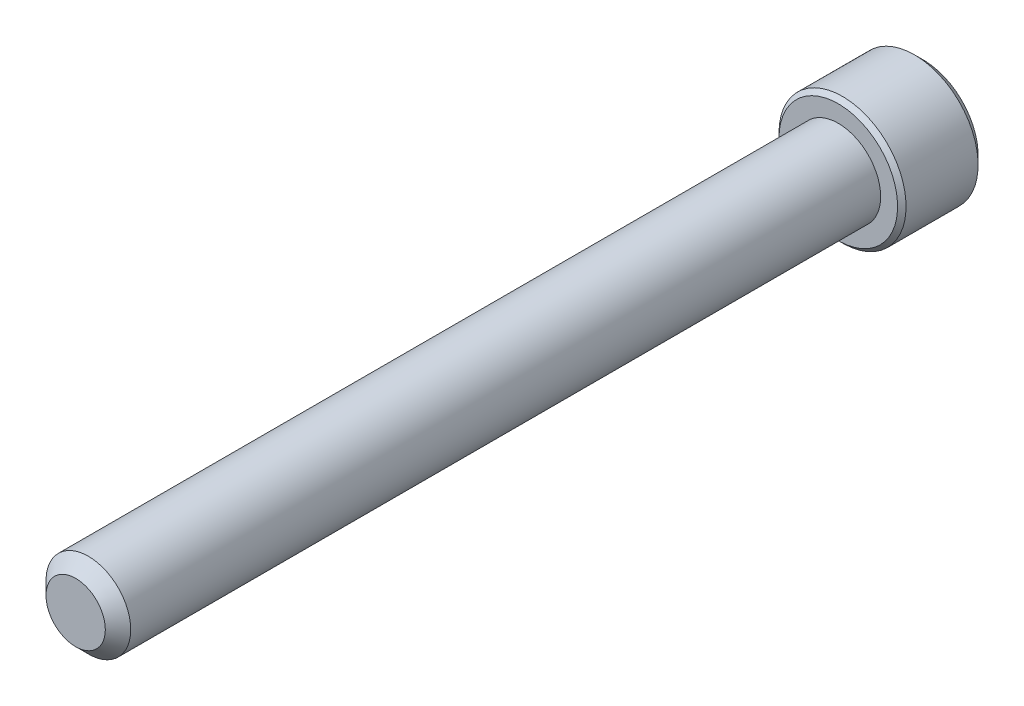
ISO-10303-21;
HEADER;
FILE_DESCRIPTION(('STEP AP214'),'2;1');
FILE_NAME('part.step','',(''),(''),'','','');
FILE_SCHEMA(('AUTOMOTIVE_DESIGN { 1 0 10303 214 1 1 1 1 }'));
ENDSEC;
DATA;
#1=APPLICATION_CONTEXT('core data for automotive mechanical design processes');
#2=APPLICATION_PROTOCOL_DEFINITION('international standard','automotive_design',2000,#1);
#3=PRODUCT_CONTEXT('',#1,'mechanical');
#4=PRODUCT('Part','Part','',(#3));
#5=PRODUCT_RELATED_PRODUCT_CATEGORY('part','',(#4));
#6=PRODUCT_DEFINITION_FORMATION('','',#4);
#7=PRODUCT_DEFINITION_CONTEXT('part definition',#1,'design');
#8=PRODUCT_DEFINITION('design','',#6,#7);
#9=PRODUCT_DEFINITION_SHAPE('','',#8);
#10=(LENGTH_UNIT() NAMED_UNIT(*) SI_UNIT(.MILLI.,.METRE.));
#11=(NAMED_UNIT(*) PLANE_ANGLE_UNIT() SI_UNIT($,.RADIAN.));
#12=(NAMED_UNIT(*) SI_UNIT($,.STERADIAN.) SOLID_ANGLE_UNIT());
#13=UNCERTAINTY_MEASURE_WITH_UNIT(LENGTH_MEASURE(1.E-05),#10,'distance_accuracy_value','');
#14=(GEOMETRIC_REPRESENTATION_CONTEXT(3) GLOBAL_UNCERTAINTY_ASSIGNED_CONTEXT((#13)) GLOBAL_UNIT_ASSIGNED_CONTEXT((#10,
#11,#12)) REPRESENTATION_CONTEXT('',''));
#15=CARTESIAN_POINT('',(0.,0.,0.));
#16=DIRECTION('',(0.,0.,1.));
#17=DIRECTION('',(1.,0.,0.));
#18=AXIS2_PLACEMENT_3D('',#15,#16,#17);
#19=CARTESIAN_POINT('',(0.,0.,-57.15));
#20=DIRECTION('',(0.,0.,1.));
#21=DIRECTION('',(1.,0.,0.));
#22=AXIS2_PLACEMENT_3D('',#19,#20,#21);
#23=CYLINDRICAL_SURFACE('',#22,3.175);
#24=CARTESIAN_POINT('',(0.,0.,-57.15));
#25=DIRECTION('',(0.,0.,-1.));
#26=DIRECTION('',(-1.,0.,0.));
#27=AXIS2_PLACEMENT_3D('',#24,#25,#26);
#28=CIRCLE('',#27,3.175);
#29=CARTESIAN_POINT('',(-3.175,0.,-57.15));
#30=VERTEX_POINT('',#29);
#31=EDGE_CURVE('E211',#30,#30,#28,.F.);
#32=ORIENTED_EDGE('',*,*,#31,.T.);
#33=EDGE_LOOP('',(#32));
#34=FACE_BOUND('',#33,.T.);
#35=CARTESIAN_POINT('',(0.,0.,-0.952500000000009));
#36=DIRECTION('',(0.,0.,1.));
#37=DIRECTION('',(1.,0.,0.));
#38=AXIS2_PLACEMENT_3D('',#35,#36,#37);
#39=CIRCLE('',#38,3.175);
#40=CARTESIAN_POINT('',(3.175,0.,-0.952500000000009));
#41=VERTEX_POINT('',#40);
#42=EDGE_CURVE('E107',#41,#41,#39,.F.);
#43=ORIENTED_EDGE('',*,*,#42,.T.);
#44=EDGE_LOOP('',(#43));
#45=FACE_BOUND('',#44,.T.);
#46=ADVANCED_FACE('F33',(#34,#45),#23,.T.);
#47=CARTESIAN_POINT('',(0.,0.,0.));
#48=DIRECTION('',(0.,0.,1.));
#49=DIRECTION('',(1.,0.,0.));
#50=AXIS2_PLACEMENT_3D('',#47,#48,#49);
#51=PLANE('',#50);
#52=CARTESIAN_POINT('',(0.,0.,0.));
#53=DIRECTION('',(0.,0.,1.));
#54=DIRECTION('',(1.,0.,0.));
#55=AXIS2_PLACEMENT_3D('',#52,#53,#54);
#56=CIRCLE('',#55,2.2225);
#57=CARTESIAN_POINT('',(2.2225,0.,0.));
#58=VERTEX_POINT('',#57);
#59=EDGE_CURVE('E210',#58,#58,#56,.T.);
#60=ORIENTED_EDGE('',*,*,#59,.T.);
#61=EDGE_LOOP('',(#60));
#62=FACE_BOUND('',#61,.T.);
#63=ADVANCED_FACE('F187',(#62),#51,.T.);
#64=CARTESIAN_POINT('',(0.,0.,0.));
#65=DIRECTION('',(0.,0.,-1.));
#66=DIRECTION('',(-1.,0.,0.));
#67=AXIS2_PLACEMENT_3D('',#64,#65,#66);
#68=CONICAL_SURFACE('',#67,2.2225,0.785398163397446);
#69=ORIENTED_EDGE('',*,*,#42,.F.);
#70=EDGE_LOOP('',(#69));
#71=FACE_BOUND('',#70,.T.);
#72=ORIENTED_EDGE('',*,*,#59,.F.);
#73=EDGE_LOOP('',(#72));
#74=FACE_BOUND('',#73,.T.);
#75=ADVANCED_FACE('F193',(#71,#74),#68,.T.);
#76=CARTESIAN_POINT('',(0.,0.,-63.5));
#77=DIRECTION('',(0.,0.,1.));
#78=DIRECTION('',(1.,0.,0.));
#79=AXIS2_PLACEMENT_3D('',#76,#77,#78);
#80=CYLINDRICAL_SURFACE('',#79,4.7625);
#81=CARTESIAN_POINT('',(0.,0.,-57.4675));
#82=DIRECTION('',(0.,0.,-1.));
#83=DIRECTION('',(-1.,0.,0.));
#84=AXIS2_PLACEMENT_3D('',#81,#82,#83);
#85=CIRCLE('',#84,4.7625);
#86=CARTESIAN_POINT('',(-4.7625,0.,-57.4675));
#87=VERTEX_POINT('',#86);
#88=EDGE_CURVE('E41',#87,#87,#85,.T.);
#89=ORIENTED_EDGE('',*,*,#88,.T.);
#90=EDGE_LOOP('',(#89));
#91=FACE_BOUND('',#90,.T.);
#92=CARTESIAN_POINT('',(0.,0.,-62.865));
#93=DIRECTION('',(0.,0.,-1.));
#94=DIRECTION('',(-1.,0.,0.));
#95=AXIS2_PLACEMENT_3D('',#92,#93,#94);
#96=CIRCLE('',#95,4.7625);
#97=CARTESIAN_POINT('',(-4.7625,0.,-62.865));
#98=VERTEX_POINT('',#97);
#99=EDGE_CURVE('E170',#98,#98,#96,.F.);
#100=ORIENTED_EDGE('',*,*,#99,.T.);
#101=EDGE_LOOP('',(#100));
#102=FACE_BOUND('',#101,.T.);
#103=ADVANCED_FACE('F175',(#91,#102),#80,.T.);
#104=CARTESIAN_POINT('',(0.,0.,-63.5));
#105=DIRECTION('',(0.,0.,-1.));
#106=DIRECTION('',(-1.,0.,0.));
#107=AXIS2_PLACEMENT_3D('',#104,#105,#106);
#108=PLANE('',#107);
#109=CARTESIAN_POINT('',(0.,0.,-63.5));
#110=DIRECTION('',(0.,0.,-1.));
#111=DIRECTION('',(-1.,0.,0.));
#112=AXIS2_PLACEMENT_3D('',#109,#110,#111);
#113=CIRCLE('',#112,4.12749999999999);
#114=CARTESIAN_POINT('',(-4.12749999999999,0.,-63.5));
#115=VERTEX_POINT('',#114);
#116=EDGE_CURVE('E106',#115,#115,#113,.T.);
#117=ORIENTED_EDGE('',*,*,#116,.T.);
#118=EDGE_LOOP('',(#117));
#119=FACE_BOUND('',#118,.T.);
#120=CARTESIAN_POINT('',(0.,0.,-63.5));
#121=DIRECTION('',(0.,0.,-1.));
#122=DIRECTION('',(-1.,0.,0.));
#123=AXIS2_PLACEMENT_3D('',#120,#121,#122);
#124=CIRCLE('',#123,2.74963065701559);
#125=CARTESIAN_POINT('',(-2.38125,1.3748153285078,-63.5));
#126=VERTEX_POINT('',#125);
#127=CARTESIAN_POINT('',(0.,2.74963065701559,-63.5));
#128=VERTEX_POINT('',#127);
#129=EDGE_CURVE('E87',#126,#128,#124,.T.);
#130=ORIENTED_EDGE('',*,*,#129,.F.);
#131=CARTESIAN_POINT('',(-2.38125,-1.3748153285078,-63.5));
#132=VERTEX_POINT('',#131);
#133=EDGE_CURVE('E47',#132,#126,#124,.T.);
#134=ORIENTED_EDGE('',*,*,#133,.F.);
#135=CARTESIAN_POINT('',(0.,-2.74963065701559,-63.5));
#136=VERTEX_POINT('',#135);
#137=EDGE_CURVE('E269',#136,#132,#124,.T.);
#138=ORIENTED_EDGE('',*,*,#137,.F.);
#139=CARTESIAN_POINT('',(2.38125,-1.3748153285078,-63.5));
#140=VERTEX_POINT('',#139);
#141=EDGE_CURVE('E54',#140,#136,#124,.T.);
#142=ORIENTED_EDGE('',*,*,#141,.F.);
#143=CARTESIAN_POINT('',(2.38125,1.3748153285078,-63.5));
#144=VERTEX_POINT('',#143);
#145=EDGE_CURVE('E128',#144,#140,#124,.T.);
#146=ORIENTED_EDGE('',*,*,#145,.F.);
#147=EDGE_CURVE('E96',#128,#144,#124,.T.);
#148=ORIENTED_EDGE('',*,*,#147,.F.);
#149=EDGE_LOOP('',(#130,#134,#138,#142,#146,#148));
#150=FACE_BOUND('',#149,.T.);
#151=ADVANCED_FACE('F127',(#119,#150),#108,.T.);
#152=CARTESIAN_POINT('',(0.,0.,-57.15));
#153=DIRECTION('',(0.,0.,-1.));
#154=DIRECTION('',(-1.,0.,0.));
#155=AXIS2_PLACEMENT_3D('',#152,#153,#154);
#156=PLANE('',#155);
#157=CARTESIAN_POINT('',(0.,0.,-57.15));
#158=DIRECTION('',(0.,0.,-1.));
#159=DIRECTION('',(-1.,0.,0.));
#160=AXIS2_PLACEMENT_3D('',#157,#158,#159);
#161=CIRCLE('',#160,4.445);
#162=CARTESIAN_POINT('',(-4.445,0.,-57.15));
#163=VERTEX_POINT('',#162);
#164=EDGE_CURVE('E11',#163,#163,#161,.F.);
#165=ORIENTED_EDGE('',*,*,#164,.T.);
#166=EDGE_LOOP('',(#165));
#167=FACE_BOUND('',#166,.T.);
#168=ORIENTED_EDGE('',*,*,#31,.F.);
#169=EDGE_LOOP('',(#168));
#170=FACE_BOUND('',#169,.T.);
#171=ADVANCED_FACE('F281',(#167,#170),#156,.F.);
#172=CARTESIAN_POINT('',(0.,0.,-63.5));
#173=DIRECTION('',(0.,0.,-1.));
#174=DIRECTION('',(-1.,0.,0.));
#175=AXIS2_PLACEMENT_3D('',#172,#173,#174);
#176=CONICAL_SURFACE('',#175,2.74963065701559,0.78539816339745);
#177=ORIENTED_EDGE('',*,*,#147,.T.);
#178=CARTESIAN_POINT('',(-0.000200000000002186,2.74974612706943,-63.5001154773272));
#179=CARTESIAN_POINT('',(0.0816567823790472,2.70248609172789,-63.4528948967096));
#180=CARTESIAN_POINT('',(0.164882333771756,2.65443579722786,-63.4084475752929));
#181=CARTESIAN_POINT('',(0.334588480838034,2.55645590753601,-63.3270654569856));
#182=CARTESIAN_POINT('',(0.421085217353096,2.50651699342501,-63.2901759430951));
#183=CARTESIAN_POINT('',(0.595501774009036,2.40581754748858,-63.2269834131659));
#184=CARTESIAN_POINT('',(0.683377171180668,2.35508266327639,-63.2005215587295));
#185=CARTESIAN_POINT('',(0.861062594070867,2.25249593653966,-63.1597515156161));
#186=CARTESIAN_POINT('',(0.950867191185862,2.20064722822085,-63.1454128915305));
#187=CARTESIAN_POINT('',(1.10563960313033,2.11128933452159,-63.1324757847701));
#188=CARTESIAN_POINT('',(1.17040744896961,2.07389560129145,-63.1305606046532));
#189=CARTESIAN_POINT('',(1.29983727933556,1.99916925388849,-63.1337866227677));
#190=CARTESIAN_POINT('',(1.36449921879335,1.96183666573622,-63.1389302948571));
#191=CARTESIAN_POINT('',(1.49321254857739,1.88752399013711,-63.1559813108716));
#192=CARTESIAN_POINT('',(1.55726317423485,1.85054434417201,-63.1678962213493));
#193=CARTESIAN_POINT('',(1.68425683890527,1.77722451768917,-63.197835672352));
#194=CARTESIAN_POINT('',(1.74719996243581,1.74088428837517,-63.2158597445184));
#195=CARTESIAN_POINT('',(1.90842615073218,1.64780030516185,-63.2693688075524));
#196=CARTESIAN_POINT('',(2.00570949128784,1.59163374230437,-63.3088874208722));
#197=CARTESIAN_POINT('',(2.14875606262557,1.50904576583588,-63.3756003435508));
#198=CARTESIAN_POINT('',(2.19589628894397,1.48182934348129,-63.3990402091113));
#199=CARTESIAN_POINT('',(2.28930352636665,1.42790064981105,-63.4480566766595));
#200=CARTESIAN_POINT('',(2.33557105249683,1.40118808114505,-63.4736319667669));
#201=CARTESIAN_POINT('',(2.38145000000001,1.37469985845396,-63.5001154773272));
#202=B_SPLINE_CURVE_WITH_KNOTS('',3,(#178,#179,#180,#181,#182,#183,#184,#185,#186,#187,#188,
#189,#190,#191,#192,#193,#194,#195,#196,#197,#198,#199,#200,#201),.UNSPECIFIED.,.F.,.F.,(4,2,2,
2,2,2,2,2,2,2,2,4),(0.,0.317196610611945,0.636241461041216,0.950218950629218,1.26340583824125,
1.48752413747843,1.71172100167746,1.93616888974081,2.16059957440836,2.51709639744763,
2.69486147369101,2.87251813383155),.UNSPECIFIED.);
#203=EDGE_CURVE('E101',#128,#144,#202,.T.);
#204=ORIENTED_EDGE('',*,*,#203,.F.);
#205=EDGE_LOOP('',(#177,#204));
#206=FACE_BOUND('',#205,.T.);
#207=ADVANCED_FACE('F102',(#206),#176,.F.);
#208=ORIENTED_EDGE('',*,*,#145,.T.);
#209=CARTESIAN_POINT('',(2.38125,-2.76261914440419,-64.3976170860817));
#210=CARTESIAN_POINT('',(2.38125,-2.69544479536901,-64.3467472146641));
#211=CARTESIAN_POINT('',(2.38125,-2.62789666157823,-64.2963629455589));
#212=CARTESIAN_POINT('',(2.38125,-2.49190448977621,-64.1967837708364));
#213=CARTESIAN_POINT('',(2.38125,-2.42346023321904,-64.1475891640069));
#214=CARTESIAN_POINT('',(2.38125,-2.28502676073674,-64.0502575507657));
#215=CARTESIAN_POINT('',(2.38125,-2.21502968492296,-64.0021316856912));
#216=CARTESIAN_POINT('',(2.38125,-2.07385103549331,-63.9076556101338));
#217=CARTESIAN_POINT('',(2.38125,-2.00266954568686,-63.8613052747739));
#218=CARTESIAN_POINT('',(2.38125,-1.85474026844007,-63.7681368561695));
#219=CARTESIAN_POINT('',(2.38125,-1.77790995637351,-63.7214491376499));
#220=CARTESIAN_POINT('',(2.38125,-1.62247617017447,-63.631129605859));
#221=CARTESIAN_POINT('',(2.38125,-1.5438729312885,-63.5874973902755));
#222=CARTESIAN_POINT('',(2.38125,-1.38486272137714,-63.5042071100282));
#223=CARTESIAN_POINT('',(2.38125,-1.30446163393307,-63.4645379009361));
#224=CARTESIAN_POINT('',(2.38125,-1.14145314547589,-63.3900690459263));
#225=CARTESIAN_POINT('',(2.38125,-1.05884677109142,-63.3552671796136));
#226=CARTESIAN_POINT('',(2.38125,-0.898296083334557,-63.294429813229));
#227=CARTESIAN_POINT('',(2.38125,-0.820539229733754,-63.2679047139327));
#228=CARTESIAN_POINT('',(2.38125,-0.663135380856752,-63.2210898392085));
#229=CARTESIAN_POINT('',(2.38125,-0.583488257498861,-63.2008004876119));
#230=CARTESIAN_POINT('',(2.38125,-0.424114177096839,-63.1678604073913));
#231=CARTESIAN_POINT('',(2.38125,-0.344414987504256,-63.1550775337025));
#232=CARTESIAN_POINT('',(2.38125,-0.184141832361606,-63.1374018129255));
#233=CARTESIAN_POINT('',(2.38125,-0.103568024531878,-63.1325075663141));
#234=CARTESIAN_POINT('',(2.38125,0.0546452704451571,-63.1309814589762));
#235=CARTESIAN_POINT('',(2.38125,0.132281935816149,-63.1340477837949));
#236=CARTESIAN_POINT('',(2.38125,0.286899761817848,-63.1476029014608));
#237=CARTESIAN_POINT('',(2.38125,0.363880858672091,-63.1580924083037));
#238=CARTESIAN_POINT('',(2.38125,0.517934845552131,-63.1860957916784));
#239=CARTESIAN_POINT('',(2.38125,0.594985552514197,-63.2037299282363));
#240=CARTESIAN_POINT('',(2.38125,0.747397784971263,-63.2450790150024));
#241=CARTESIAN_POINT('',(2.38125,0.822759444078564,-63.2687934823661));
#242=CARTESIAN_POINT('',(2.38125,1.05910849740066,-63.3521079749025));
#243=CARTESIAN_POINT('',(2.38125,1.21677702097593,-63.4211581302676));
#244=CARTESIAN_POINT('',(2.38125,1.44750538913539,-63.5362600462423));
#245=CARTESIAN_POINT('',(2.38125,1.52359597394722,-63.5766390556527));
#246=CARTESIAN_POINT('',(2.38125,1.67404919579933,-63.6605045047098));
#247=CARTESIAN_POINT('',(2.38125,1.74841213968921,-63.7039903868604));
#248=CARTESIAN_POINT('',(2.38125,1.89195740305346,-63.791219749271));
#249=CARTESIAN_POINT('',(2.38125,1.96121355997409,-63.8348431031729));
#250=CARTESIAN_POINT('',(2.38125,2.0985382616552,-63.9239297072439));
#251=CARTESIAN_POINT('',(2.38125,2.16660671605604,-63.9693930965357));
#252=CARTESIAN_POINT('',(2.38125,2.30115854912696,-64.0614552844234));
#253=CARTESIAN_POINT('',(2.38125,2.36765030390081,-64.1080418918462));
#254=CARTESIAN_POINT('',(2.38125,2.49972444191925,-64.2024503249111));
#255=CARTESIAN_POINT('',(2.38125,2.56530707034482,-64.2502718071541));
#256=CARTESIAN_POINT('',(2.38125,2.63050906958838,-64.2985984122085));
#257=B_SPLINE_CURVE_WITH_KNOTS('',3,(#209,#210,#211,#212,#213,#214,#215,#216,#217,#218,#219,
#220,#221,#222,#223,#224,#225,#226,#227,#228,#229,#230,#231,#232,#233,#234,#235,#236,#237,#238,
#239,#240,#241,#242,#243,#244,#245,#246,#247,#248,#249,#250,#251,#252,#253,#254,#255,#256),
.UNSPECIFIED.,.F.,.F.,(4,2,2,2,2,2,2,2,2,2,2,2,2,2,2,2,2,2,2,2,2,2,2,4),(0.,0.252791871598824,
0.505646586889959,0.760459562213687,1.01525458294591,1.28490904202319,1.55452792920362,
1.82336591151044,2.09208085189144,2.33833488227845,2.58460564635828,2.82639989379205,
3.06815123972669,3.30087188936525,3.53361492618305,3.77045005614643,4.00726638464205,
4.52203846871503,4.78044014408766,5.038795567844,5.28431582225893,5.5298546749629,
5.77340315409169,6.01688462048991),.UNSPECIFIED.);
#258=EDGE_CURVE('E95',#144,#140,#257,.F.);
#259=ORIENTED_EDGE('',*,*,#258,.F.);
#260=EDGE_LOOP('',(#208,#259));
#261=FACE_BOUND('',#260,.T.);
#262=ADVANCED_FACE('F275',(#261),#176,.F.);
#263=ORIENTED_EDGE('',*,*,#141,.T.);
#264=CARTESIAN_POINT('',(2.38145,-1.37469985845396,-63.5001154773272));
#265=CARTESIAN_POINT('',(2.29959321762095,-1.4219598937955,-63.4528948967096));
#266=CARTESIAN_POINT('',(2.21636766622824,-1.47001018829554,-63.4084475752929));
#267=CARTESIAN_POINT('',(2.04666151916196,-1.56799007798739,-63.3270654569856));
#268=CARTESIAN_POINT('',(1.9601647826469,-1.61792899209838,-63.2901759430951));
#269=CARTESIAN_POINT('',(1.78574822599096,-1.71862843803482,-63.2269834131659));
#270=CARTESIAN_POINT('',(1.69787282881932,-1.76936332224701,-63.2005215587295));
#271=CARTESIAN_POINT('',(1.52018740592912,-1.87195004898374,-63.1597515156161));
#272=CARTESIAN_POINT('',(1.43038280881412,-1.92379875730255,-63.1454128915305));
#273=CARTESIAN_POINT('',(1.27561039686965,-2.01315665100182,-63.1324757847701));
#274=CARTESIAN_POINT('',(1.21084255103037,-2.05055038423195,-63.1305606046532));
#275=CARTESIAN_POINT('',(1.08141272066442,-2.12527673163491,-63.1337866227677));
#276=CARTESIAN_POINT('',(1.01675078120664,-2.16260931978718,-63.1389302948571));
#277=CARTESIAN_POINT('',(0.888037451422593,-2.23692199538629,-63.1559813108716));
#278=CARTESIAN_POINT('',(0.823986825765135,-2.27390164135139,-63.1678962213493));
#279=CARTESIAN_POINT('',(0.696993161094715,-2.34722146783423,-63.197835672352));
#280=CARTESIAN_POINT('',(0.634050037564164,-2.38356169714823,-63.2158597445184));
#281=CARTESIAN_POINT('',(0.472823849267811,-2.47664568036155,-63.2693688075524));
#282=CARTESIAN_POINT('',(0.375540508712157,-2.53281224321902,-63.3088874208722));
#283=CARTESIAN_POINT('',(0.23249393737443,-2.61540021968751,-63.3756003435508));
#284=CARTESIAN_POINT('',(0.185353711056033,-2.6426166420421,-63.3990402091113));
#285=CARTESIAN_POINT('',(0.0919464736333571,-2.69654533571234,-63.4480566766595));
#286=CARTESIAN_POINT('',(0.0456789475031738,-2.72325790437834,-63.4736319667669));
#287=CARTESIAN_POINT('',(-0.000200000000005868,-2.74974612706943,-63.5001154773272));
#288=B_SPLINE_CURVE_WITH_KNOTS('',3,(#264,#265,#266,#267,#268,#269,#270,#271,#272,#273,#274,
#275,#276,#277,#278,#279,#280,#281,#282,#283,#284,#285,#286,#287),.UNSPECIFIED.,.F.,.F.,(4,2,2,
2,2,2,2,2,2,2,2,4),(0.,0.317196610611948,0.636241461041223,0.950218950629232,1.26340583824128,
1.48752413747846,1.71172100167748,1.93616888974084,2.16059957440838,2.51709639744763,
2.694861473691,2.87251813383155),.UNSPECIFIED.);
#289=EDGE_CURVE('E138',#140,#136,#288,.T.);
#290=ORIENTED_EDGE('',*,*,#289,.F.);
#291=EDGE_LOOP('',(#263,#290));
#292=FACE_BOUND('',#291,.T.);
#293=ADVANCED_FACE('F272',(#292),#176,.F.);
#294=ORIENTED_EDGE('',*,*,#137,.T.);
#295=CARTESIAN_POINT('',(0.000200000000002537,-2.74974612706943,-63.5001154773272));
#296=CARTESIAN_POINT('',(-0.0816567823790469,-2.70248609172789,-63.4528948967096));
#297=CARTESIAN_POINT('',(-0.164882333771756,-2.65443579722786,-63.4084475752929));
#298=CARTESIAN_POINT('',(-0.334588480838034,-2.55645590753601,-63.3270654569856));
#299=CARTESIAN_POINT('',(-0.421085217353096,-2.50651699342501,-63.2901759430951));
#300=CARTESIAN_POINT('',(-0.595501774009036,-2.40581754748858,-63.2269834131659));
#301=CARTESIAN_POINT('',(-0.683377171180668,-2.35508266327639,-63.2005215587295));
#302=CARTESIAN_POINT('',(-0.861062594070868,-2.25249593653966,-63.1597515156161));
#303=CARTESIAN_POINT('',(-0.950867191185862,-2.20064722822085,-63.1454128915305));
#304=CARTESIAN_POINT('',(-1.10563960313033,-2.11128933452159,-63.1324757847701));
#305=CARTESIAN_POINT('',(-1.17040744896961,-2.07389560129145,-63.1305606046532));
#306=CARTESIAN_POINT('',(-1.29983727933557,-1.99916925388849,-63.1337866227677));
#307=CARTESIAN_POINT('',(-1.36449921879335,-1.96183666573622,-63.1389302948571));
#308=CARTESIAN_POINT('',(-1.49321254857739,-1.88752399013711,-63.1559813108716));
#309=CARTESIAN_POINT('',(-1.55726317423485,-1.85054434417201,-63.1678962213493));
#310=CARTESIAN_POINT('',(-1.68425683890526,-1.77722451768917,-63.197835672352));
#311=CARTESIAN_POINT('',(-1.74719996243582,-1.74088428837517,-63.2158597445184));
#312=CARTESIAN_POINT('',(-1.90842615073218,-1.64780030516185,-63.2693688075524));
#313=CARTESIAN_POINT('',(-2.00570949128784,-1.59163374230437,-63.3088874208722));
#314=CARTESIAN_POINT('',(-2.14875606262557,-1.50904576583588,-63.3756003435508));
#315=CARTESIAN_POINT('',(-2.19589628894397,-1.48182934348129,-63.3990402091113));
#316=CARTESIAN_POINT('',(-2.28930352636665,-1.42790064981105,-63.4480566766595));
#317=CARTESIAN_POINT('',(-2.33557105249683,-1.40118808114505,-63.4736319667669));
#318=CARTESIAN_POINT('',(-2.38145000000001,-1.37469985845396,-63.5001154773272));
#319=B_SPLINE_CURVE_WITH_KNOTS('',3,(#295,#296,#297,#298,#299,#300,#301,#302,#303,#304,#305,
#306,#307,#308,#309,#310,#311,#312,#313,#314,#315,#316,#317,#318),.UNSPECIFIED.,.F.,.F.,(4,2,2,
2,2,2,2,2,2,2,2,4),(0.,0.317196610611945,0.636241461041216,0.950218950629219,1.26340583824125,
1.48752413747844,1.71172100167747,1.93616888974081,2.16059957440836,2.51709639744763,
2.69486147369101,2.87251813383155),.UNSPECIFIED.);
#320=EDGE_CURVE('E246',#136,#132,#319,.T.);
#321=ORIENTED_EDGE('',*,*,#320,.F.);
#322=EDGE_LOOP('',(#294,#321));
#323=FACE_BOUND('',#322,.T.);
#324=ADVANCED_FACE('F271',(#323),#176,.F.);
#325=ORIENTED_EDGE('',*,*,#133,.T.);
#326=CARTESIAN_POINT('',(-2.38125,-2.76261914440418,-64.3976170860817));
#327=CARTESIAN_POINT('',(-2.38125,-2.695444795369,-64.346747214664));
#328=CARTESIAN_POINT('',(-2.38125,-2.62789666157821,-64.2963629455589));
#329=CARTESIAN_POINT('',(-2.38125,-2.49190448977619,-64.1967837708364));
#330=CARTESIAN_POINT('',(-2.38125,-2.42346023321902,-64.1475891640069));
#331=CARTESIAN_POINT('',(-2.38125,-2.28502676073671,-64.0502575507657));
#332=CARTESIAN_POINT('',(-2.38125,-2.21502968492293,-64.0021316856912));
#333=CARTESIAN_POINT('',(-2.38125,-2.07385103549328,-63.9076556101338));
#334=CARTESIAN_POINT('',(-2.38125,-2.00266954568683,-63.8613052747739));
#335=CARTESIAN_POINT('',(-2.38125,-1.85474026844004,-63.7681368561695));
#336=CARTESIAN_POINT('',(-2.38125,-1.77790995637348,-63.7214491376499));
#337=CARTESIAN_POINT('',(-2.38125,-1.62247617017445,-63.631129605859));
#338=CARTESIAN_POINT('',(-2.38125,-1.54387293128848,-63.5874973902755));
#339=CARTESIAN_POINT('',(-2.38125,-1.38486272137712,-63.5042071100282));
#340=CARTESIAN_POINT('',(-2.38125,-1.30446163393305,-63.4645379009361));
#341=CARTESIAN_POINT('',(-2.38125,-1.14145314547588,-63.3900690459263));
#342=CARTESIAN_POINT('',(-2.38125,-1.05884677109141,-63.3552671796135));
#343=CARTESIAN_POINT('',(-2.38125,-0.898296083334547,-63.294429813229));
#344=CARTESIAN_POINT('',(-2.38125,-0.820539229733744,-63.2679047139327));
#345=CARTESIAN_POINT('',(-2.38125,-0.663135380856743,-63.2210898392085));
#346=CARTESIAN_POINT('',(-2.38125,-0.583488257498854,-63.2008004876119));
#347=CARTESIAN_POINT('',(-2.38125,-0.424114177096836,-63.1678604073913));
#348=CARTESIAN_POINT('',(-2.38125,-0.344414987504255,-63.1550775337025));
#349=CARTESIAN_POINT('',(-2.38125,-0.18414183236161,-63.1374018129255));
#350=CARTESIAN_POINT('',(-2.38125,-0.103568024531885,-63.1325075663141));
#351=CARTESIAN_POINT('',(-2.38125,0.0546452704451489,-63.1309814589762));
#352=CARTESIAN_POINT('',(-2.38125,0.132281935816142,-63.1340477837949));
#353=CARTESIAN_POINT('',(-2.38125,0.286899761817842,-63.1476029014608));
#354=CARTESIAN_POINT('',(-2.38125,0.363880858672086,-63.1580924083037));
#355=CARTESIAN_POINT('',(-2.38125,0.517934845552128,-63.1860957916784));
#356=CARTESIAN_POINT('',(-2.38125,0.594985552514195,-63.2037299282363));
#357=CARTESIAN_POINT('',(-2.38125,0.747397784971263,-63.2450790150024));
#358=CARTESIAN_POINT('',(-2.38125,0.822759444078565,-63.2687934823661));
#359=CARTESIAN_POINT('',(-2.38125,1.05910849740066,-63.3521079749025));
#360=CARTESIAN_POINT('',(-2.38125,1.21677702097593,-63.4211581302676));
#361=CARTESIAN_POINT('',(-2.38125,1.44750538913539,-63.5362600462423));
#362=CARTESIAN_POINT('',(-2.38125,1.52359597394723,-63.5766390556527));
#363=CARTESIAN_POINT('',(-2.38125,1.67404919579934,-63.6605045047098));
#364=CARTESIAN_POINT('',(-2.38125,1.74841213968921,-63.7039903868604));
#365=CARTESIAN_POINT('',(-2.38125,1.89195740305346,-63.791219749271));
#366=CARTESIAN_POINT('',(-2.38125,1.96121355997409,-63.8348431031729));
#367=CARTESIAN_POINT('',(-2.38125,2.0985382616552,-63.9239297072439));
#368=CARTESIAN_POINT('',(-2.38125,2.16660671605604,-63.9693930965357));
#369=CARTESIAN_POINT('',(-2.38125,2.30115854912696,-64.0614552844234));
#370=CARTESIAN_POINT('',(-2.38125,2.3676503039008,-64.1080418918462));
#371=CARTESIAN_POINT('',(-2.38125,2.49972444191925,-64.2024503249111));
#372=CARTESIAN_POINT('',(-2.38125,2.56530707034481,-64.2502718071541));
#373=CARTESIAN_POINT('',(-2.38125,2.63050906958838,-64.2985984122085));
#374=B_SPLINE_CURVE_WITH_KNOTS('',3,(#326,#327,#328,#329,#330,#331,#332,#333,#334,#335,#336,
#337,#338,#339,#340,#341,#342,#343,#344,#345,#346,#347,#348,#349,#350,#351,#352,#353,#354,#355,
#356,#357,#358,#359,#360,#361,#362,#363,#364,#365,#366,#367,#368,#369,#370,#371,#372,#373),
.UNSPECIFIED.,.F.,.F.,(4,2,2,2,2,2,2,2,2,2,2,2,2,2,2,2,2,2,2,2,2,2,2,4),(0.,0.252791871598828,
0.505646586889973,0.760459562213706,1.01525458294593,1.2849090420232,1.55452792920363,
1.82336591151043,2.09208085189144,2.33833488227844,2.58460564635827,2.82639989379203,
3.06815123972666,3.30087188936522,3.53361492618303,3.77045005614641,4.00726638464204,
4.52203846871501,4.78044014408765,5.03879556784398,5.28431582225892,5.52985467496288,
5.77340315409167,6.01688462048989),.UNSPECIFIED.);
#375=EDGE_CURVE('E117',#132,#126,#374,.T.);
#376=ORIENTED_EDGE('',*,*,#375,.F.);
#377=EDGE_LOOP('',(#325,#376));
#378=FACE_BOUND('',#377,.T.);
#379=ADVANCED_FACE('F288',(#378),#176,.F.);
#380=ORIENTED_EDGE('',*,*,#129,.T.);
#381=CARTESIAN_POINT('',(-2.38145,1.37469985845396,-63.5001154773272));
#382=CARTESIAN_POINT('',(-2.29959321762095,1.4219598937955,-63.4528948967096));
#383=CARTESIAN_POINT('',(-2.21636766622824,1.47001018829554,-63.4084475752929));
#384=CARTESIAN_POINT('',(-2.04666151916196,1.56799007798739,-63.3270654569856));
#385=CARTESIAN_POINT('',(-1.9601647826469,1.61792899209838,-63.2901759430951));
#386=CARTESIAN_POINT('',(-1.78574822599096,1.71862843803482,-63.2269834131659));
#387=CARTESIAN_POINT('',(-1.69787282881932,1.76936332224701,-63.2005215587295));
#388=CARTESIAN_POINT('',(-1.52018740592912,1.87195004898374,-63.1597515156161));
#389=CARTESIAN_POINT('',(-1.43038280881412,1.92379875730255,-63.1454128915305));
#390=CARTESIAN_POINT('',(-1.27561039686965,2.01315665100182,-63.1324757847701));
#391=CARTESIAN_POINT('',(-1.21084255103037,2.05055038423195,-63.1305606046532));
#392=CARTESIAN_POINT('',(-1.08141272066442,2.12527673163491,-63.1337866227677));
#393=CARTESIAN_POINT('',(-1.01675078120664,2.16260931978718,-63.1389302948571));
#394=CARTESIAN_POINT('',(-0.888037451422595,2.23692199538629,-63.1559813108716));
#395=CARTESIAN_POINT('',(-0.823986825765137,2.27390164135139,-63.1678962213493));
#396=CARTESIAN_POINT('',(-0.696993161094717,2.34722146783423,-63.197835672352));
#397=CARTESIAN_POINT('',(-0.634050037564165,2.38356169714823,-63.2158597445184));
#398=CARTESIAN_POINT('',(-0.472823849267809,2.47664568036155,-63.2693688075524));
#399=CARTESIAN_POINT('',(-0.375540508712152,2.53281224321902,-63.3088874208722));
#400=CARTESIAN_POINT('',(-0.232493937374423,2.61540021968751,-63.3756003435508));
#401=CARTESIAN_POINT('',(-0.185353711056028,2.6426166420421,-63.3990402091113));
#402=CARTESIAN_POINT('',(-0.0919464736333545,2.69654533571234,-63.4480566766595));
#403=CARTESIAN_POINT('',(-0.0456789475031725,2.72325790437834,-63.4736319667669));
#404=CARTESIAN_POINT('',(0.000200000000006204,2.74974612706943,-63.5001154773272));
#405=B_SPLINE_CURVE_WITH_KNOTS('',3,(#381,#382,#383,#384,#385,#386,#387,#388,#389,#390,#391,
#392,#393,#394,#395,#396,#397,#398,#399,#400,#401,#402,#403,#404),.UNSPECIFIED.,.F.,.F.,(4,2,2,
2,2,2,2,2,2,2,2,4),(0.,0.317196610611949,0.636241461041224,0.950218950629233,1.26340583824127,
1.48752413747846,1.71172100167748,1.93616888974083,2.16059957440838,2.51709639744764,
2.69486147369101,2.87251813383155),.UNSPECIFIED.);
#406=EDGE_CURVE('E91',#126,#128,#405,.T.);
#407=ORIENTED_EDGE('',*,*,#406,.F.);
#408=EDGE_LOOP('',(#380,#407));
#409=FACE_BOUND('',#408,.T.);
#410=ADVANCED_FACE('F89',(#409),#176,.F.);
#411=CARTESIAN_POINT('',(2.38125,4.12444598552339,-59.928125));
#412=DIRECTION('',(0.,0.,-1.));
#413=DIRECTION('',(-1.,0.,0.));
#414=AXIS2_PLACEMENT_3D('',#411,#412,#413);
#415=PLANE('',#414);
#416=DIRECTION('',(0.866025403784439,0.5,0.));
#417=VECTOR('',#416,1.);
#418=CARTESIAN_POINT('',(-2.38125,1.3748153285078,-59.928125));
#419=LINE('',#418,#417);
#420=CARTESIAN_POINT('',(-2.38125,1.3748153285078,-59.928125));
#421=VERTEX_POINT('',#420);
#422=CARTESIAN_POINT('',(0.,2.74963065701559,-59.928125));
#423=VERTEX_POINT('',#422);
#424=EDGE_CURVE('E116',#421,#423,#419,.T.);
#425=ORIENTED_EDGE('',*,*,#424,.T.);
#426=DIRECTION('',(0.866025403784439,-0.5,0.));
#427=VECTOR('',#426,1.);
#428=CARTESIAN_POINT('',(0.,2.74963065701559,-59.928125));
#429=LINE('',#428,#427);
#430=CARTESIAN_POINT('',(2.38125,1.3748153285078,-59.928125));
#431=VERTEX_POINT('',#430);
#432=EDGE_CURVE('E121',#423,#431,#429,.T.);
#433=ORIENTED_EDGE('',*,*,#432,.T.);
#434=DIRECTION('',(0.,-1.,0.));
#435=VECTOR('',#434,1.);
#436=CARTESIAN_POINT('',(2.38125,1.3748153285078,-59.928125));
#437=LINE('',#436,#435);
#438=CARTESIAN_POINT('',(2.38125,-1.3748153285078,-59.928125));
#439=VERTEX_POINT('',#438);
#440=EDGE_CURVE('E232',#431,#439,#437,.T.);
#441=ORIENTED_EDGE('',*,*,#440,.T.);
#442=DIRECTION('',(-0.866025403784439,-0.5,0.));
#443=VECTOR('',#442,1.);
#444=CARTESIAN_POINT('',(2.38125,-1.3748153285078,-59.928125));
#445=LINE('',#444,#443);
#446=CARTESIAN_POINT('',(0.,-2.74963065701559,-59.928125));
#447=VERTEX_POINT('',#446);
#448=EDGE_CURVE('E229',#439,#447,#445,.T.);
#449=ORIENTED_EDGE('',*,*,#448,.T.);
#450=DIRECTION('',(-0.866025403784439,0.5,0.));
#451=VECTOR('',#450,1.);
#452=CARTESIAN_POINT('',(0.,-2.74963065701559,-59.928125));
#453=LINE('',#452,#451);
#454=CARTESIAN_POINT('',(-2.38125,-1.3748153285078,-59.928125));
#455=VERTEX_POINT('',#454);
#456=EDGE_CURVE('E226',#447,#455,#453,.T.);
#457=ORIENTED_EDGE('',*,*,#456,.T.);
#458=DIRECTION('',(0.,1.,0.));
#459=VECTOR('',#458,1.);
#460=CARTESIAN_POINT('',(-2.38125,-1.3748153285078,-59.928125));
#461=LINE('',#460,#459);
#462=EDGE_CURVE('E124',#455,#421,#461,.T.);
#463=ORIENTED_EDGE('',*,*,#462,.T.);
#464=EDGE_LOOP('',(#425,#433,#441,#449,#457,#463));
#465=FACE_BOUND('',#464,.T.);
#466=ADVANCED_FACE('F158',(#465),#415,.T.);
#467=CARTESIAN_POINT('',(0.,2.74963065701559,-59.928125));
#468=DIRECTION('',(0.5,0.866025403784439,0.));
#469=DIRECTION('',(-0.866025403784439,0.5,0.));
#470=AXIS2_PLACEMENT_3D('',#467,#468,#469);
#471=PLANE('',#470);
#472=DIRECTION('',(0.,0.,-1.));
#473=VECTOR('',#472,1.);
#474=CARTESIAN_POINT('',(0.,2.74963065701559,-59.928125));
#475=LINE('',#474,#473);
#476=EDGE_CURVE('E113',#423,#128,#475,.T.);
#477=ORIENTED_EDGE('',*,*,#476,.T.);
#478=ORIENTED_EDGE('',*,*,#203,.T.);
#479=DIRECTION('',(0.,0.,-1.));
#480=VECTOR('',#479,1.);
#481=CARTESIAN_POINT('',(2.38125,1.3748153285078,-59.928125));
#482=LINE('',#481,#480);
#483=EDGE_CURVE('E123',#431,#144,#482,.T.);
#484=ORIENTED_EDGE('',*,*,#483,.F.);
#485=ORIENTED_EDGE('',*,*,#432,.F.);
#486=EDGE_LOOP('',(#477,#478,#484,#485));
#487=FACE_BOUND('',#486,.T.);
#488=ADVANCED_FACE('F119',(#487),#471,.F.);
#489=CARTESIAN_POINT('',(2.38125,1.3748153285078,-59.928125));
#490=DIRECTION('',(1.,0.,0.));
#491=DIRECTION('',(0.,1.,0.));
#492=AXIS2_PLACEMENT_3D('',#489,#490,#491);
#493=PLANE('',#492);
#494=ORIENTED_EDGE('',*,*,#483,.T.);
#495=ORIENTED_EDGE('',*,*,#258,.T.);
#496=DIRECTION('',(0.,0.,-1.));
#497=VECTOR('',#496,1.);
#498=CARTESIAN_POINT('',(2.38125,-1.3748153285078,-59.928125));
#499=LINE('',#498,#497);
#500=EDGE_CURVE('E215',#439,#140,#499,.T.);
#501=ORIENTED_EDGE('',*,*,#500,.F.);
#502=ORIENTED_EDGE('',*,*,#440,.F.);
#503=EDGE_LOOP('',(#494,#495,#501,#502));
#504=FACE_BOUND('',#503,.T.);
#505=ADVANCED_FACE('F147',(#504),#493,.F.);
#506=CARTESIAN_POINT('',(2.38125,-1.3748153285078,-59.928125));
#507=DIRECTION('',(0.5,-0.866025403784439,0.));
#508=DIRECTION('',(0.866025403784439,0.5,0.));
#509=AXIS2_PLACEMENT_3D('',#506,#507,#508);
#510=PLANE('',#509);
#511=ORIENTED_EDGE('',*,*,#500,.T.);
#512=ORIENTED_EDGE('',*,*,#289,.T.);
#513=DIRECTION('',(0.,0.,-1.));
#514=VECTOR('',#513,1.);
#515=CARTESIAN_POINT('',(0.,-2.74963065701559,-59.928125));
#516=LINE('',#515,#514);
#517=EDGE_CURVE('E218',#447,#136,#516,.T.);
#518=ORIENTED_EDGE('',*,*,#517,.F.);
#519=ORIENTED_EDGE('',*,*,#448,.F.);
#520=EDGE_LOOP('',(#511,#512,#518,#519));
#521=FACE_BOUND('',#520,.T.);
#522=ADVANCED_FACE('F151',(#521),#510,.F.);
#523=CARTESIAN_POINT('',(0.,-2.74963065701559,-59.928125));
#524=DIRECTION('',(-0.5,-0.866025403784439,0.));
#525=DIRECTION('',(0.866025403784439,-0.5,0.));
#526=AXIS2_PLACEMENT_3D('',#523,#524,#525);
#527=PLANE('',#526);
#528=ORIENTED_EDGE('',*,*,#517,.T.);
#529=ORIENTED_EDGE('',*,*,#320,.T.);
#530=DIRECTION('',(0.,0.,-1.));
#531=VECTOR('',#530,1.);
#532=CARTESIAN_POINT('',(-2.38125,-1.3748153285078,-59.928125));
#533=LINE('',#532,#531);
#534=EDGE_CURVE('E221',#455,#132,#533,.T.);
#535=ORIENTED_EDGE('',*,*,#534,.F.);
#536=ORIENTED_EDGE('',*,*,#456,.F.);
#537=EDGE_LOOP('',(#528,#529,#535,#536));
#538=FACE_BOUND('',#537,.T.);
#539=ADVANCED_FACE('F254',(#538),#527,.F.);
#540=CARTESIAN_POINT('',(-2.38125,-1.3748153285078,-59.928125));
#541=DIRECTION('',(-1.,0.,0.));
#542=DIRECTION('',(0.,-1.,0.));
#543=AXIS2_PLACEMENT_3D('',#540,#541,#542);
#544=PLANE('',#543);
#545=ORIENTED_EDGE('',*,*,#534,.T.);
#546=ORIENTED_EDGE('',*,*,#375,.T.);
#547=DIRECTION('',(0.,0.,-1.));
#548=VECTOR('',#547,1.);
#549=CARTESIAN_POINT('',(-2.38125,1.3748153285078,-59.928125));
#550=LINE('',#549,#548);
#551=EDGE_CURVE('E115',#421,#126,#550,.T.);
#552=ORIENTED_EDGE('',*,*,#551,.F.);
#553=ORIENTED_EDGE('',*,*,#462,.F.);
#554=EDGE_LOOP('',(#545,#546,#552,#553));
#555=FACE_BOUND('',#554,.T.);
#556=ADVANCED_FACE('F251',(#555),#544,.F.);
#557=CARTESIAN_POINT('',(-2.38125,1.3748153285078,-59.928125));
#558=DIRECTION('',(-0.5,0.866025403784439,0.));
#559=DIRECTION('',(-0.866025403784439,-0.5,0.));
#560=AXIS2_PLACEMENT_3D('',#557,#558,#559);
#561=PLANE('',#560);
#562=ORIENTED_EDGE('',*,*,#551,.T.);
#563=ORIENTED_EDGE('',*,*,#406,.T.);
#564=ORIENTED_EDGE('',*,*,#476,.F.);
#565=ORIENTED_EDGE('',*,*,#424,.F.);
#566=EDGE_LOOP('',(#562,#563,#564,#565));
#567=FACE_BOUND('',#566,.T.);
#568=ADVANCED_FACE('F111',(#567),#561,.F.);
#569=CARTESIAN_POINT('',(0.,0.,-63.5));
#570=DIRECTION('',(0.,0.,1.));
#571=DIRECTION('',(1.,0.,0.));
#572=AXIS2_PLACEMENT_3D('',#569,#570,#571);
#573=CONICAL_SURFACE('',#572,4.12749999999999,0.785398163397435);
#574=ORIENTED_EDGE('',*,*,#99,.F.);
#575=EDGE_LOOP('',(#574));
#576=FACE_BOUND('',#575,.T.);
#577=ORIENTED_EDGE('',*,*,#116,.F.);
#578=EDGE_LOOP('',(#577));
#579=FACE_BOUND('',#578,.T.);
#580=ADVANCED_FACE('F179',(#576,#579),#573,.T.);
#581=CARTESIAN_POINT('',(0.,0.,-57.4675));
#582=DIRECTION('',(0.,0.,-1.));
#583=DIRECTION('',(-1.,0.,0.));
#584=AXIS2_PLACEMENT_3D('',#581,#582,#583);
#585=CONICAL_SURFACE('',#584,4.7625,0.785398163397444);
#586=ORIENTED_EDGE('',*,*,#164,.F.);
#587=EDGE_LOOP('',(#586));
#588=FACE_BOUND('',#587,.T.);
#589=ORIENTED_EDGE('',*,*,#88,.F.);
#590=EDGE_LOOP('',(#589));
#591=FACE_BOUND('',#590,.T.);
#592=ADVANCED_FACE('F35',(#588,#591),#585,.T.);
#593=CLOSED_SHELL('',(#46,#63,#75,#103,#151,#171,#207,#262,#293,#324,#379,#410,#466,#488,#505,
#522,#539,#556,#568,#580,#592));
#594=MANIFOLD_SOLID_BREP('B2',#593);
#595=ADVANCED_BREP_SHAPE_REPRESENTATION('',(#18,#594),#14);
#596=SHAPE_DEFINITION_REPRESENTATION(#9,#595);
ENDSEC;
END-ISO-10303-21;
